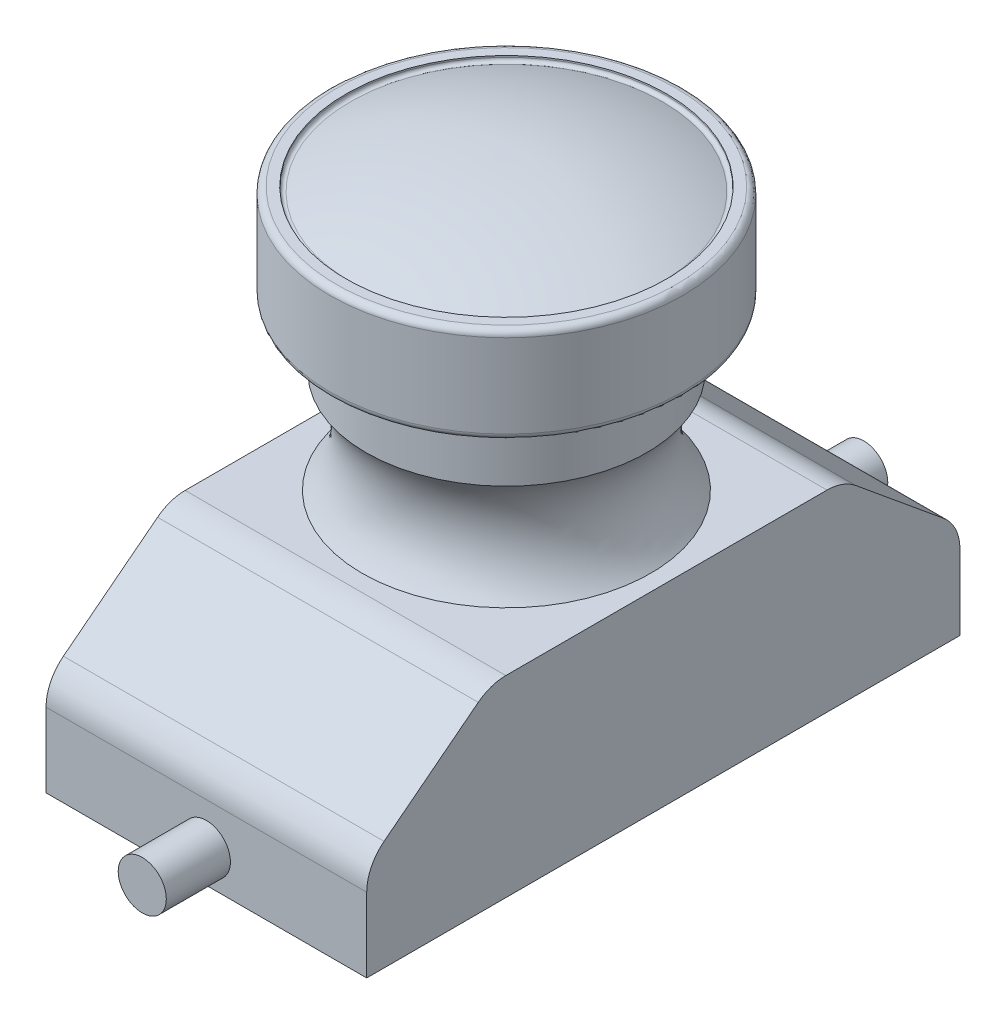
ISO-10303-21;
HEADER;
FILE_DESCRIPTION(('STEP AP214'),'2;1');
FILE_NAME('part.step','',(''),(''),'','','');
FILE_SCHEMA(('AUTOMOTIVE_DESIGN { 1 0 10303 214 1 1 1 1 }'));
ENDSEC;
DATA;
#1=APPLICATION_CONTEXT('core data for automotive mechanical design processes');
#2=APPLICATION_PROTOCOL_DEFINITION('international standard','automotive_design',2000,#1);
#3=PRODUCT_CONTEXT('',#1,'mechanical');
#4=PRODUCT('Part','Part','',(#3));
#5=PRODUCT_RELATED_PRODUCT_CATEGORY('part','',(#4));
#6=PRODUCT_DEFINITION_FORMATION('','',#4);
#7=PRODUCT_DEFINITION_CONTEXT('part definition',#1,'design');
#8=PRODUCT_DEFINITION('design','',#6,#7);
#9=PRODUCT_DEFINITION_SHAPE('','',#8);
#10=(LENGTH_UNIT() NAMED_UNIT(*) SI_UNIT(.MILLI.,.METRE.));
#11=(NAMED_UNIT(*) PLANE_ANGLE_UNIT() SI_UNIT($,.RADIAN.));
#12=(NAMED_UNIT(*) SI_UNIT($,.STERADIAN.) SOLID_ANGLE_UNIT());
#13=UNCERTAINTY_MEASURE_WITH_UNIT(LENGTH_MEASURE(1.E-05),#10,'distance_accuracy_value','');
#14=(GEOMETRIC_REPRESENTATION_CONTEXT(3) GLOBAL_UNCERTAINTY_ASSIGNED_CONTEXT((#13)) GLOBAL_UNIT_ASSIGNED_CONTEXT((#10,
#11,#12)) REPRESENTATION_CONTEXT('',''));
#15=CARTESIAN_POINT('',(0.,0.,0.));
#16=DIRECTION('',(0.,0.,1.));
#17=DIRECTION('',(1.,0.,0.));
#18=AXIS2_PLACEMENT_3D('',#15,#16,#17);
#19=CARTESIAN_POINT('',(5.,5.99362673541504,5.50758291933047));
#20=DIRECTION('',(0.,-1.,0.));
#21=DIRECTION('',(0.,0.,-1.));
#22=AXIS2_PLACEMENT_3D('',#19,#20,#21);
#23=PLANE('',#22);
#24=CARTESIAN_POINT('',(0.,5.99362673541504,0.00758291933046842));
#25=DIRECTION('',(0.,-1.,0.));
#26=DIRECTION('',(0.,0.,-1.));
#27=AXIS2_PLACEMENT_3D('',#24,#25,#26);
#28=CIRCLE('',#27,4.5);
#29=CARTESIAN_POINT('',(0.,5.99362673541504,-4.49241708066953));
#30=VERTEX_POINT('',#29);
#31=EDGE_CURVE('E227',#30,#30,#28,.T.);
#32=ORIENTED_EDGE('',*,*,#31,.T.);
#33=EDGE_LOOP('',(#32));
#34=FACE_BOUND('',#33,.T.);
#35=DIRECTION('',(0.,0.,1.));
#36=VECTOR('',#35,1.);
#37=CARTESIAN_POINT('',(5.,5.99362673541504,5.50758291933047));
#38=LINE('',#37,#36);
#39=CARTESIAN_POINT('',(5.,5.99362673541504,-4.99019765527548));
#40=VERTEX_POINT('',#39);
#41=CARTESIAN_POINT('',(5.,5.99362673541504,5.0271839133107));
#42=VERTEX_POINT('',#41);
#43=EDGE_CURVE('E213',#40,#42,#38,.T.);
#44=ORIENTED_EDGE('',*,*,#43,.F.);
#45=DIRECTION('',(-1.,0.,0.));
#46=VECTOR('',#45,1.);
#47=CARTESIAN_POINT('',(5.,5.99362673541504,-4.99019765527548));
#48=LINE('',#47,#46);
#49=CARTESIAN_POINT('',(-5.,5.99362673541504,-4.99019765527548));
#50=VERTEX_POINT('',#49);
#51=EDGE_CURVE('E188',#40,#50,#48,.T.);
#52=ORIENTED_EDGE('',*,*,#51,.T.);
#53=DIRECTION('',(0.,0.,1.));
#54=VECTOR('',#53,1.);
#55=CARTESIAN_POINT('',(-5.,5.99362673541504,5.50758291933047));
#56=LINE('',#55,#54);
#57=CARTESIAN_POINT('',(-5.,5.99362673541504,5.0271839133107));
#58=VERTEX_POINT('',#57);
#59=EDGE_CURVE('E223',#50,#58,#56,.T.);
#60=ORIENTED_EDGE('',*,*,#59,.T.);
#61=DIRECTION('',(-1.,0.,0.));
#62=VECTOR('',#61,1.);
#63=CARTESIAN_POINT('',(5.,5.99362673541504,5.0271839133107));
#64=LINE('',#63,#62);
#65=EDGE_CURVE('E186',#58,#42,#64,.F.);
#66=ORIENTED_EDGE('',*,*,#65,.T.);
#67=EDGE_LOOP('',(#44,#52,#60,#66));
#68=FACE_BOUND('',#67,.T.);
#69=ADVANCED_FACE('F40',(#34,#68),#23,.F.);
#70=CARTESIAN_POINT('',(5.,2.99362673541504,9.36423594558007));
#71=DIRECTION('',(0.,-0.789314429232731,-0.613989195185883));
#72=DIRECTION('',(0.,0.613989195185883,-0.789314429232731));
#73=AXIS2_PLACEMENT_3D('',#70,#71,#72);
#74=PLANE('',#73);
#75=DIRECTION('',(0.,-0.613989195185883,0.789314429232731));
#76=VECTOR('',#75,1.);
#77=CARTESIAN_POINT('',(-5.,2.99362673541504,9.36423594558007));
#78=LINE('',#77,#76);
#79=CARTESIAN_POINT('',(-5.,5.69866693634086,5.88676878657093));
#80=VERTEX_POINT('',#79);
#81=CARTESIAN_POINT('',(-5.,3.41400299669252,8.8238208188403));
#82=VERTEX_POINT('',#81);
#83=EDGE_CURVE('E226',#80,#82,#78,.T.);
#84=ORIENTED_EDGE('',*,*,#83,.T.);
#85=DIRECTION('',(-1.,0.,0.));
#86=VECTOR('',#85,1.);
#87=CARTESIAN_POINT('',(5.,3.41400299669252,8.8238208188403));
#88=LINE('',#87,#86);
#89=CARTESIAN_POINT('',(5.,3.41400299669252,8.8238208188403));
#90=VERTEX_POINT('',#89);
#91=EDGE_CURVE('E63',#82,#90,#88,.F.);
#92=ORIENTED_EDGE('',*,*,#91,.T.);
#93=DIRECTION('',(0.,-0.613989195185883,0.789314429232731));
#94=VECTOR('',#93,1.);
#95=CARTESIAN_POINT('',(5.,2.99362673541504,9.36423594558007));
#96=LINE('',#95,#94);
#97=CARTESIAN_POINT('',(5.,5.69866693634086,5.88676878657093));
#98=VERTEX_POINT('',#97);
#99=EDGE_CURVE('E209',#98,#90,#96,.T.);
#100=ORIENTED_EDGE('',*,*,#99,.F.);
#101=DIRECTION('',(-1.,0.,0.));
#102=VECTOR('',#101,1.);
#103=CARTESIAN_POINT('',(5.,5.69866693634086,5.88676878657093));
#104=LINE('',#103,#102);
#105=EDGE_CURVE('E192',#98,#80,#104,.T.);
#106=ORIENTED_EDGE('',*,*,#105,.T.);
#107=EDGE_LOOP('',(#84,#92,#100,#106));
#108=FACE_BOUND('',#107,.T.);
#109=ADVANCED_FACE('F139',(#108),#74,.F.);
#110=CARTESIAN_POINT('',(5.,-0.00637326458496207,9.36423594558007));
#111=DIRECTION('',(0.,0.,-1.));
#112=DIRECTION('',(-1.,0.,0.));
#113=AXIS2_PLACEMENT_3D('',#110,#111,#112);
#114=PLANE('',#113);
#115=CARTESIAN_POINT('',(0.,1.,9.36423594558007));
#116=DIRECTION('',(0.,0.,-1.));
#117=DIRECTION('',(-1.,0.,0.));
#118=AXIS2_PLACEMENT_3D('',#115,#116,#117);
#119=CIRCLE('',#118,0.75);
#120=CARTESIAN_POINT('',(-0.75,1.,9.36423594558007));
#121=VERTEX_POINT('',#120);
#122=EDGE_CURVE('E48',#121,#121,#119,.F.);
#123=ORIENTED_EDGE('',*,*,#122,.F.);
#124=EDGE_LOOP('',(#123));
#125=FACE_BOUND('',#124,.T.);
#126=DIRECTION('',(0.,-1.,0.));
#127=VECTOR('',#126,1.);
#128=CARTESIAN_POINT('',(5.,-0.00637326458496207,9.36423594558007));
#129=LINE('',#128,#127);
#130=CARTESIAN_POINT('',(5.,2.3089627957667,9.36423594558007));
#131=VERTEX_POINT('',#130);
#132=CARTESIAN_POINT('',(5.,-0.00637326458496207,9.36423594558007));
#133=VERTEX_POINT('',#132);
#134=EDGE_CURVE('E203',#131,#133,#129,.T.);
#135=ORIENTED_EDGE('',*,*,#134,.F.);
#136=DIRECTION('',(-1.,0.,0.));
#137=VECTOR('',#136,1.);
#138=CARTESIAN_POINT('',(5.,2.3089627957667,9.36423594558007));
#139=LINE('',#138,#137);
#140=CARTESIAN_POINT('',(-5.,2.3089627957667,9.36423594558007));
#141=VERTEX_POINT('',#140);
#142=EDGE_CURVE('E175',#131,#141,#139,.T.);
#143=ORIENTED_EDGE('',*,*,#142,.T.);
#144=DIRECTION('',(0.,-1.,0.));
#145=VECTOR('',#144,1.);
#146=CARTESIAN_POINT('',(-5.,-0.00637326458496207,9.36423594558007));
#147=LINE('',#146,#145);
#148=CARTESIAN_POINT('',(-5.,-0.00637326458496207,9.36423594558007));
#149=VERTEX_POINT('',#148);
#150=EDGE_CURVE('E229',#141,#149,#147,.T.);
#151=ORIENTED_EDGE('',*,*,#150,.T.);
#152=DIRECTION('',(-1.,0.,0.));
#153=VECTOR('',#152,1.);
#154=CARTESIAN_POINT('',(5.,-0.00637326458496207,9.36423594558007));
#155=LINE('',#154,#153);
#156=EDGE_CURVE('E206',#133,#149,#155,.T.);
#157=ORIENTED_EDGE('',*,*,#156,.F.);
#158=EDGE_LOOP('',(#135,#143,#151,#157));
#159=FACE_BOUND('',#158,.T.);
#160=ADVANCED_FACE('F145',(#125,#159),#114,.F.);
#161=CARTESIAN_POINT('',(5.,-0.00637326458496207,9.36423594558007));
#162=DIRECTION('',(0.,1.,0.));
#163=DIRECTION('',(0.,0.,1.));
#164=AXIS2_PLACEMENT_3D('',#161,#162,#163);
#165=PLANE('',#164);
#166=DIRECTION('',(0.,0.,-1.));
#167=VECTOR('',#166,1.);
#168=CARTESIAN_POINT('',(-5.,-0.00637326458496207,9.36423594558007));
#169=LINE('',#168,#167);
#170=CARTESIAN_POINT('',(-5.,-0.00637326458496207,-9.13576405441993));
#171=VERTEX_POINT('',#170);
#172=EDGE_CURVE('E231',#149,#171,#169,.T.);
#173=ORIENTED_EDGE('',*,*,#172,.T.);
#174=DIRECTION('',(-1.,0.,0.));
#175=VECTOR('',#174,1.);
#176=CARTESIAN_POINT('',(5.,-0.00637326458496207,-9.13576405441993));
#177=LINE('',#176,#175);
#178=CARTESIAN_POINT('',(5.,-0.00637326458496207,-9.13576405441993));
#179=VERTEX_POINT('',#178);
#180=EDGE_CURVE('E222',#179,#171,#177,.T.);
#181=ORIENTED_EDGE('',*,*,#180,.F.);
#182=DIRECTION('',(0.,0.,-1.));
#183=VECTOR('',#182,1.);
#184=CARTESIAN_POINT('',(5.,-0.00637326458496207,9.36423594558007));
#185=LINE('',#184,#183);
#186=EDGE_CURVE('E208',#133,#179,#185,.T.);
#187=ORIENTED_EDGE('',*,*,#186,.F.);
#188=ORIENTED_EDGE('',*,*,#156,.T.);
#189=EDGE_LOOP('',(#173,#181,#187,#188));
#190=FACE_BOUND('',#189,.T.);
#191=ADVANCED_FACE('F201',(#190),#165,.F.);
#192=CARTESIAN_POINT('',(5.,2.99362673541504,-9.13576405441994));
#193=DIRECTION('',(0.,0.,1.));
#194=DIRECTION('',(0.,-1.,0.));
#195=AXIS2_PLACEMENT_3D('',#192,#193,#194);
#196=PLANE('',#195);
#197=CARTESIAN_POINT('',(0.,0.999999999999995,-9.13576405441993));
#198=DIRECTION('',(0.,0.,1.));
#199=DIRECTION('',(0.,-1.,0.));
#200=AXIS2_PLACEMENT_3D('',#197,#198,#199);
#201=CIRCLE('',#200,0.75);
#202=CARTESIAN_POINT('',(0.,0.249999999999995,-9.13576405441993));
#203=VERTEX_POINT('',#202);
#204=EDGE_CURVE('E11',#203,#203,#201,.F.);
#205=ORIENTED_EDGE('',*,*,#204,.F.);
#206=EDGE_LOOP('',(#205));
#207=FACE_BOUND('',#206,.T.);
#208=DIRECTION('',(0.,1.,0.));
#209=VECTOR('',#208,1.);
#210=CARTESIAN_POINT('',(-5.,2.99362673541504,-9.13576405441994));
#211=LINE('',#210,#209);
#212=CARTESIAN_POINT('',(-5.,2.33287604195182,-9.13576405441994));
#213=VERTEX_POINT('',#212);
#214=EDGE_CURVE('E233',#171,#213,#211,.T.);
#215=ORIENTED_EDGE('',*,*,#214,.T.);
#216=DIRECTION('',(-1.,0.,0.));
#217=VECTOR('',#216,1.);
#218=CARTESIAN_POINT('',(5.,2.33287604195182,-9.13576405441994));
#219=LINE('',#218,#217);
#220=CARTESIAN_POINT('',(5.,2.33287604195182,-9.13576405441994));
#221=VERTEX_POINT('',#220);
#222=EDGE_CURVE('E181',#213,#221,#219,.F.);
#223=ORIENTED_EDGE('',*,*,#222,.T.);
#224=DIRECTION('',(0.,1.,0.));
#225=VECTOR('',#224,1.);
#226=CARTESIAN_POINT('',(5.,2.99362673541504,-9.13576405441994));
#227=LINE('',#226,#225);
#228=EDGE_CURVE('E211',#179,#221,#227,.T.);
#229=ORIENTED_EDGE('',*,*,#228,.F.);
#230=ORIENTED_EDGE('',*,*,#180,.T.);
#231=EDGE_LOOP('',(#215,#223,#229,#230));
#232=FACE_BOUND('',#231,.T.);
#233=ADVANCED_FACE('F274',(#207,#232),#196,.F.);
#234=CARTESIAN_POINT('',(5.,5.99362673541504,-5.49241708066953));
#235=DIRECTION('',(0.,-0.771972177142526,0.635656320441973));
#236=DIRECTION('',(0.,-0.635656320441973,-0.771972177142526));
#237=AXIS2_PLACEMENT_3D('',#234,#235,#236);
#238=PLANE('',#237);
#239=DIRECTION('',(0.,0.635656320441973,0.771972177142526));
#240=VECTOR('',#239,1.);
#241=CARTESIAN_POINT('',(5.,5.99362673541504,-5.49241708066953));
#242=LINE('',#241,#240);
#243=CARTESIAN_POINT('',(5.,3.41363708995135,-8.6256829030387));
#244=VERTEX_POINT('',#243);
#245=CARTESIAN_POINT('',(5.,5.67438778341458,-5.88011650389424));
#246=VERTEX_POINT('',#245);
#247=EDGE_CURVE('E219',#244,#246,#242,.T.);
#248=ORIENTED_EDGE('',*,*,#247,.F.);
#249=DIRECTION('',(-1.,0.,0.));
#250=VECTOR('',#249,1.);
#251=CARTESIAN_POINT('',(5.,3.41363708995135,-8.6256829030387));
#252=LINE('',#251,#250);
#253=CARTESIAN_POINT('',(-5.,3.41363708995135,-8.6256829030387));
#254=VERTEX_POINT('',#253);
#255=EDGE_CURVE('E261',#244,#254,#252,.T.);
#256=ORIENTED_EDGE('',*,*,#255,.T.);
#257=DIRECTION('',(0.,0.635656320441973,0.771972177142526));
#258=VECTOR('',#257,1.);
#259=CARTESIAN_POINT('',(-5.,5.99362673541504,-5.49241708066953));
#260=LINE('',#259,#258);
#261=CARTESIAN_POINT('',(-5.,5.67438778341458,-5.88011650389424));
#262=VERTEX_POINT('',#261);
#263=EDGE_CURVE('E236',#254,#262,#260,.T.);
#264=ORIENTED_EDGE('',*,*,#263,.T.);
#265=DIRECTION('',(-1.,0.,0.));
#266=VECTOR('',#265,1.);
#267=CARTESIAN_POINT('',(5.,5.67438778341458,-5.88011650389424));
#268=LINE('',#267,#266);
#269=EDGE_CURVE('E259',#262,#246,#268,.F.);
#270=ORIENTED_EDGE('',*,*,#269,.T.);
#271=EDGE_LOOP('',(#248,#256,#264,#270));
#272=FACE_BOUND('',#271,.T.);
#273=ADVANCED_FACE('F283',(#272),#238,.F.);
#274=CARTESIAN_POINT('',(5.,0.,0.));
#275=DIRECTION('',(-1.,0.,0.));
#276=DIRECTION('',(0.,0.,1.));
#277=AXIS2_PLACEMENT_3D('',#274,#275,#276);
#278=PLANE('',#277);
#279=ORIENTED_EDGE('',*,*,#228,.T.);
#280=CARTESIAN_POINT('',(5.,2.33287604195182,-7.73576405441993));
#281=DIRECTION('',(-1.,0.,0.));
#282=DIRECTION('',(0.,0.,1.));
#283=AXIS2_PLACEMENT_3D('',#280,#281,#282);
#284=CIRCLE('',#283,1.4);
#285=EDGE_CURVE('E179',#221,#244,#284,.F.);
#286=ORIENTED_EDGE('',*,*,#285,.T.);
#287=ORIENTED_EDGE('',*,*,#247,.T.);
#288=CARTESIAN_POINT('',(5.,4.59362673541504,-4.99019765527548));
#289=DIRECTION('',(-1.,0.,0.));
#290=DIRECTION('',(0.,0.,1.));
#291=AXIS2_PLACEMENT_3D('',#288,#289,#290);
#292=CIRCLE('',#291,1.4);
#293=EDGE_CURVE('E176',#246,#40,#292,.F.);
#294=ORIENTED_EDGE('',*,*,#293,.T.);
#295=ORIENTED_EDGE('',*,*,#43,.T.);
#296=CARTESIAN_POINT('',(5.,4.59362673541504,5.0271839133107));
#297=DIRECTION('',(-1.,0.,0.));
#298=DIRECTION('',(0.,0.,1.));
#299=AXIS2_PLACEMENT_3D('',#296,#297,#298);
#300=CIRCLE('',#299,1.4);
#301=EDGE_CURVE('E177',#42,#98,#300,.F.);
#302=ORIENTED_EDGE('',*,*,#301,.T.);
#303=ORIENTED_EDGE('',*,*,#99,.T.);
#304=CARTESIAN_POINT('',(5.,2.3089627957667,7.96423594558007));
#305=DIRECTION('',(-1.,0.,0.));
#306=DIRECTION('',(0.,0.,1.));
#307=AXIS2_PLACEMENT_3D('',#304,#305,#306);
#308=CIRCLE('',#307,1.4);
#309=EDGE_CURVE('E55',#90,#131,#308,.F.);
#310=ORIENTED_EDGE('',*,*,#309,.T.);
#311=ORIENTED_EDGE('',*,*,#134,.T.);
#312=ORIENTED_EDGE('',*,*,#186,.T.);
#313=EDGE_LOOP('',(#279,#286,#287,#294,#295,#302,#303,#310,#311,#312));
#314=FACE_BOUND('',#313,.T.);
#315=ADVANCED_FACE('F277',(#314),#278,.F.);
#316=CARTESIAN_POINT('',(-5.,0.,0.));
#317=DIRECTION('',(-1.,0.,0.));
#318=DIRECTION('',(0.,0.,1.));
#319=AXIS2_PLACEMENT_3D('',#316,#317,#318);
#320=PLANE('',#319);
#321=ORIENTED_EDGE('',*,*,#263,.F.);
#322=CARTESIAN_POINT('',(-5.,2.33287604195182,-7.73576405441993));
#323=DIRECTION('',(-1.,0.,0.));
#324=DIRECTION('',(0.,0.,1.));
#325=AXIS2_PLACEMENT_3D('',#322,#323,#324);
#326=CIRCLE('',#325,1.4);
#327=EDGE_CURVE('E270',#254,#213,#326,.T.);
#328=ORIENTED_EDGE('',*,*,#327,.T.);
#329=ORIENTED_EDGE('',*,*,#214,.F.);
#330=ORIENTED_EDGE('',*,*,#172,.F.);
#331=ORIENTED_EDGE('',*,*,#150,.F.);
#332=CARTESIAN_POINT('',(-5.,2.3089627957667,7.96423594558007));
#333=DIRECTION('',(-1.,0.,0.));
#334=DIRECTION('',(0.,0.,1.));
#335=AXIS2_PLACEMENT_3D('',#332,#333,#334);
#336=CIRCLE('',#335,1.4);
#337=EDGE_CURVE('E266',#141,#82,#336,.T.);
#338=ORIENTED_EDGE('',*,*,#337,.T.);
#339=ORIENTED_EDGE('',*,*,#83,.F.);
#340=CARTESIAN_POINT('',(-5.,4.59362673541504,5.0271839133107));
#341=DIRECTION('',(-1.,0.,0.));
#342=DIRECTION('',(0.,0.,1.));
#343=AXIS2_PLACEMENT_3D('',#340,#341,#342);
#344=CIRCLE('',#343,1.4);
#345=EDGE_CURVE('E264',#80,#58,#344,.T.);
#346=ORIENTED_EDGE('',*,*,#345,.T.);
#347=ORIENTED_EDGE('',*,*,#59,.F.);
#348=CARTESIAN_POINT('',(-5.,4.59362673541504,-4.99019765527548));
#349=DIRECTION('',(-1.,0.,0.));
#350=DIRECTION('',(0.,0.,1.));
#351=AXIS2_PLACEMENT_3D('',#348,#349,#350);
#352=CIRCLE('',#351,1.4);
#353=EDGE_CURVE('E268',#50,#262,#352,.T.);
#354=ORIENTED_EDGE('',*,*,#353,.T.);
#355=EDGE_LOOP('',(#321,#328,#329,#330,#331,#338,#339,#346,#347,#354));
#356=FACE_BOUND('',#355,.T.);
#357=ADVANCED_FACE('F286',(#356),#320,.T.);
#358=CARTESIAN_POINT('',(0.,7.66507101754234,0.00758291933046842));
#359=DIRECTION('',(0.,-1.,0.));
#360=DIRECTION('',(0.,0.,-1.));
#361=AXIS2_PLACEMENT_3D('',#358,#359,#360);
#362=TOROIDAL_SURFACE('',#361,6.3591057021439,2.5);
#363=ORIENTED_EDGE('',*,*,#31,.F.);
#364=EDGE_LOOP('',(#363));
#365=FACE_BOUND('',#364,.T.);
#366=CARTESIAN_POINT('',(0.,9.19362673541504,0.00758291933046842));
#367=DIRECTION('',(0.,-1.,0.));
#368=DIRECTION('',(0.,0.,-1.));
#369=AXIS2_PLACEMENT_3D('',#366,#367,#368);
#370=CIRCLE('',#369,4.38084449154539);
#371=CARTESIAN_POINT('',(0.,9.19362673541504,-4.37326157221492));
#372=VERTEX_POINT('',#371);
#373=EDGE_CURVE('E296',#372,#372,#370,.T.);
#374=ORIENTED_EDGE('',*,*,#373,.T.);
#375=EDGE_LOOP('',(#374));
#376=FACE_BOUND('',#375,.T.);
#377=ADVANCED_FACE('F333',(#365,#376),#362,.F.);
#378=CARTESIAN_POINT('',(0.,5.99362673541504,0.00758291933046842));
#379=DIRECTION('',(0.,-1.,0.));
#380=DIRECTION('',(0.,0.,-1.));
#381=AXIS2_PLACEMENT_3D('',#378,#379,#380);
#382=CYLINDRICAL_SURFACE('',#381,4.38084449154539);
#383=ORIENTED_EDGE('',*,*,#373,.F.);
#384=EDGE_LOOP('',(#383));
#385=FACE_BOUND('',#384,.T.);
#386=CARTESIAN_POINT('',(0.,11.193626735415,0.00758291933046842));
#387=DIRECTION('',(0.,-1.,0.));
#388=DIRECTION('',(0.,0.,-1.));
#389=AXIS2_PLACEMENT_3D('',#386,#387,#388);
#390=CIRCLE('',#389,4.38084449154539);
#391=CARTESIAN_POINT('',(0.,11.193626735415,-4.37326157221492));
#392=VERTEX_POINT('',#391);
#393=EDGE_CURVE('E299',#392,#392,#390,.T.);
#394=ORIENTED_EDGE('',*,*,#393,.T.);
#395=EDGE_LOOP('',(#394));
#396=FACE_BOUND('',#395,.T.);
#397=ADVANCED_FACE('F338',(#385,#396),#382,.T.);
#398=CARTESIAN_POINT('',(0.,11.193626735415,5.50758291933047));
#399=DIRECTION('',(0.,1.,0.));
#400=DIRECTION('',(0.,0.,1.));
#401=AXIS2_PLACEMENT_3D('',#398,#399,#400);
#402=PLANE('',#401);
#403=CARTESIAN_POINT('',(0.,11.193626735415,0.00758291933046842));
#404=DIRECTION('',(0.,1.,0.));
#405=DIRECTION('',(0.,0.,1.));
#406=AXIS2_PLACEMENT_3D('',#403,#404,#405);
#407=CIRCLE('',#406,5.3);
#408=CARTESIAN_POINT('',(0.,11.193626735415,5.30758291933047));
#409=VERTEX_POINT('',#408);
#410=EDGE_CURVE('E242',#409,#409,#407,.F.);
#411=ORIENTED_EDGE('',*,*,#410,.T.);
#412=EDGE_LOOP('',(#411));
#413=FACE_BOUND('',#412,.T.);
#414=ORIENTED_EDGE('',*,*,#393,.F.);
#415=EDGE_LOOP('',(#414));
#416=FACE_BOUND('',#415,.T.);
#417=ADVANCED_FACE('F342',(#413,#416),#402,.F.);
#418=CARTESIAN_POINT('',(0.,5.99362673541504,0.00758291933046842));
#419=DIRECTION('',(0.,-1.,0.));
#420=DIRECTION('',(0.,0.,-1.));
#421=AXIS2_PLACEMENT_3D('',#418,#419,#420);
#422=CYLINDRICAL_SURFACE('',#421,5.5);
#423=CARTESIAN_POINT('',(0.,11.393626735415,0.00758291933046842));
#424=DIRECTION('',(0.,1.,0.));
#425=DIRECTION('',(0.,0.,1.));
#426=AXIS2_PLACEMENT_3D('',#423,#424,#425);
#427=CIRCLE('',#426,5.5);
#428=CARTESIAN_POINT('',(0.,11.393626735415,5.50758291933047));
#429=VERTEX_POINT('',#428);
#430=EDGE_CURVE('E248',#429,#429,#427,.T.);
#431=ORIENTED_EDGE('',*,*,#430,.T.);
#432=EDGE_LOOP('',(#431));
#433=FACE_BOUND('',#432,.T.);
#434=CARTESIAN_POINT('',(0.,13.993626735415,0.00758291933046842));
#435=DIRECTION('',(0.,-1.,0.));
#436=DIRECTION('',(0.,0.,-1.));
#437=AXIS2_PLACEMENT_3D('',#434,#435,#436);
#438=CIRCLE('',#437,5.5);
#439=CARTESIAN_POINT('',(0.,13.993626735415,-5.49241708066953));
#440=VERTEX_POINT('',#439);
#441=EDGE_CURVE('E245',#440,#440,#438,.T.);
#442=ORIENTED_EDGE('',*,*,#441,.T.);
#443=EDGE_LOOP('',(#442));
#444=FACE_BOUND('',#443,.T.);
#445=ADVANCED_FACE('F346',(#433,#444),#422,.T.);
#446=CARTESIAN_POINT('',(0.,14.193626735415,5.00758291933047));
#447=DIRECTION('',(0.,-1.,0.));
#448=DIRECTION('',(0.,0.,-1.));
#449=AXIS2_PLACEMENT_3D('',#446,#447,#448);
#450=PLANE('',#449);
#451=CARTESIAN_POINT('',(0.,14.193626735415,0.00758291933046842));
#452=DIRECTION('',(0.,-1.,0.));
#453=DIRECTION('',(0.,0.,-1.));
#454=AXIS2_PLACEMENT_3D('',#451,#452,#453);
#455=CIRCLE('',#454,5.3);
#456=CARTESIAN_POINT('',(0.,14.193626735415,-5.29241708066953));
#457=VERTEX_POINT('',#456);
#458=EDGE_CURVE('E251',#457,#457,#455,.F.);
#459=ORIENTED_EDGE('',*,*,#458,.T.);
#460=EDGE_LOOP('',(#459));
#461=FACE_BOUND('',#460,.T.);
#462=CARTESIAN_POINT('',(0.,14.193626735415,0.00758291933046842));
#463=DIRECTION('',(0.,-1.,0.));
#464=DIRECTION('',(0.,0.,-1.));
#465=AXIS2_PLACEMENT_3D('',#462,#463,#464);
#466=CIRCLE('',#465,5.);
#467=CARTESIAN_POINT('',(0.,14.193626735415,-4.99241708066953));
#468=VERTEX_POINT('',#467);
#469=EDGE_CURVE('E302',#468,#468,#466,.T.);
#470=ORIENTED_EDGE('',*,*,#469,.T.);
#471=EDGE_LOOP('',(#470));
#472=FACE_BOUND('',#471,.T.);
#473=ADVANCED_FACE('F133',(#461,#472),#450,.F.);
#474=CARTESIAN_POINT('',(0.,5.99362673541504,0.00758291933046842));
#475=DIRECTION('',(0.,-1.,0.));
#476=DIRECTION('',(0.,0.,-1.));
#477=AXIS2_PLACEMENT_3D('',#474,#475,#476);
#478=CYLINDRICAL_SURFACE('',#477,5.);
#479=CARTESIAN_POINT('',(0.,14.14532797354,0.00758291933046842));
#480=DIRECTION('',(0.,-1.,0.));
#481=DIRECTION('',(0.,0.,-1.));
#482=AXIS2_PLACEMENT_3D('',#479,#480,#481);
#483=CIRCLE('',#482,5.);
#484=CARTESIAN_POINT('',(0.,14.14532797354,-4.99241708066953));
#485=VERTEX_POINT('',#484);
#486=EDGE_CURVE('E254',#485,#485,#483,.T.);
#487=ORIENTED_EDGE('',*,*,#486,.T.);
#488=EDGE_LOOP('',(#487));
#489=FACE_BOUND('',#488,.T.);
#490=ORIENTED_EDGE('',*,*,#469,.F.);
#491=EDGE_LOOP('',(#490));
#492=FACE_BOUND('',#491,.T.);
#493=ADVANCED_FACE('F123',(#489,#492),#478,.F.);
#494=CARTESIAN_POINT('',(0.,2.99529909781754,-0.19275155315003));
#495=DIRECTION('',(-1.,0.,0.));
#496=DIRECTION('',(0.,0.,-1.));
#497=AXIS2_PLACEMENT_3D('',#494,#495,#496);
#498=CIRCLE('',#497,12.);
#499=TRIMMED_CURVE('',#498,(PARAMETER_VALUE(-1.58749164174817)),
(PARAMETER_VALUE(1.58749164174817)),.T.,.PARAMETER.);
#500=CARTESIAN_POINT('',(0.,2.99529909781754,0.00758291933046842));
#501=DIRECTION('',(0.,-1.,0.));
#502=AXIS1_PLACEMENT('',#500,#501);
#503=SURFACE_OF_REVOLUTION('',#499,#502);
#504=CARTESIAN_POINT('',(0.,14.0531789745671,0.00758291933046842));
#505=DIRECTION('',(0.,-1.,0.));
#506=DIRECTION('',(0.,0.,-1.));
#507=AXIS2_PLACEMENT_3D('',#504,#505,#506);
#508=CIRCLE('',#507,4.86115978902876);
#509=CARTESIAN_POINT('',(0.,14.0531789745671,-4.8535768696983));
#510=VERTEX_POINT('',#509);
#511=EDGE_CURVE('E257',#510,#510,#508,.F.);
#512=ORIENTED_EDGE('',*,*,#511,.T.);
#513=EDGE_LOOP('',(#512));
#514=FACE_BOUND('',#513,.T.);
#515=CARTESIAN_POINT('',(0.,14.993626735415,0.00758291933046842));
#516=VERTEX_POINT('',#515);
#517=VERTEX_LOOP('',#516);
#518=FACE_BOUND('',#517,.T.);
#519=ADVANCED_FACE('F120',(#514,#518),#503,.T.);
#520=CARTESIAN_POINT('',(0.,11.393626735415,0.00758291933046842));
#521=DIRECTION('',(0.,1.,0.));
#522=DIRECTION('',(0.,0.,1.));
#523=AXIS2_PLACEMENT_3D('',#520,#521,#522);
#524=TOROIDAL_SURFACE('',#523,5.3,0.2);
#525=ORIENTED_EDGE('',*,*,#430,.F.);
#526=EDGE_LOOP('',(#525));
#527=FACE_BOUND('',#526,.T.);
#528=ORIENTED_EDGE('',*,*,#410,.F.);
#529=EDGE_LOOP('',(#528));
#530=FACE_BOUND('',#529,.T.);
#531=ADVANCED_FACE('F122',(#527,#530),#524,.T.);
#532=CARTESIAN_POINT('',(0.,13.993626735415,0.00758291933046842));
#533=DIRECTION('',(0.,-1.,0.));
#534=DIRECTION('',(0.,0.,-1.));
#535=AXIS2_PLACEMENT_3D('',#532,#533,#534);
#536=TOROIDAL_SURFACE('',#535,5.3,0.2);
#537=ORIENTED_EDGE('',*,*,#458,.F.);
#538=EDGE_LOOP('',(#537));
#539=FACE_BOUND('',#538,.T.);
#540=ORIENTED_EDGE('',*,*,#441,.F.);
#541=EDGE_LOOP('',(#540));
#542=FACE_BOUND('',#541,.T.);
#543=ADVANCED_FACE('F130',(#539,#542),#536,.T.);
#544=CARTESIAN_POINT('',(0.,14.14532797354,0.00758291933046842));
#545=DIRECTION('',(0.,-1.,0.));
#546=DIRECTION('',(0.,0.,-1.));
#547=AXIS2_PLACEMENT_3D('',#544,#545,#546);
#548=TOROIDAL_SURFACE('',#547,4.9,0.1);
#549=ORIENTED_EDGE('',*,*,#511,.F.);
#550=EDGE_LOOP('',(#549));
#551=FACE_BOUND('',#550,.T.);
#552=ORIENTED_EDGE('',*,*,#486,.F.);
#553=EDGE_LOOP('',(#552));
#554=FACE_BOUND('',#553,.T.);
#555=ADVANCED_FACE('F153',(#551,#554),#548,.F.);
#556=CARTESIAN_POINT('',(5.,2.33287604195182,-7.73576405441993));
#557=DIRECTION('',(-1.,0.,0.));
#558=DIRECTION('',(0.,0.,1.));
#559=AXIS2_PLACEMENT_3D('',#556,#557,#558);
#560=CYLINDRICAL_SURFACE('',#559,1.4);
#561=ORIENTED_EDGE('',*,*,#285,.F.);
#562=ORIENTED_EDGE('',*,*,#222,.F.);
#563=ORIENTED_EDGE('',*,*,#327,.F.);
#564=ORIENTED_EDGE('',*,*,#255,.F.);
#565=EDGE_LOOP('',(#561,#562,#563,#564));
#566=FACE_BOUND('',#565,.T.);
#567=ADVANCED_FACE('F157',(#566),#560,.T.);
#568=CARTESIAN_POINT('',(5.,4.59362673541504,-4.99019765527548));
#569=DIRECTION('',(-1.,0.,0.));
#570=DIRECTION('',(0.,0.,1.));
#571=AXIS2_PLACEMENT_3D('',#568,#569,#570);
#572=CYLINDRICAL_SURFACE('',#571,1.4);
#573=ORIENTED_EDGE('',*,*,#293,.F.);
#574=ORIENTED_EDGE('',*,*,#269,.F.);
#575=ORIENTED_EDGE('',*,*,#353,.F.);
#576=ORIENTED_EDGE('',*,*,#51,.F.);
#577=EDGE_LOOP('',(#573,#574,#575,#576));
#578=FACE_BOUND('',#577,.T.);
#579=ADVANCED_FACE('F161',(#578),#572,.T.);
#580=CARTESIAN_POINT('',(5.,2.3089627957667,7.96423594558007));
#581=DIRECTION('',(-1.,0.,0.));
#582=DIRECTION('',(0.,0.,1.));
#583=AXIS2_PLACEMENT_3D('',#580,#581,#582);
#584=CYLINDRICAL_SURFACE('',#583,1.4);
#585=ORIENTED_EDGE('',*,*,#309,.F.);
#586=ORIENTED_EDGE('',*,*,#91,.F.);
#587=ORIENTED_EDGE('',*,*,#337,.F.);
#588=ORIENTED_EDGE('',*,*,#142,.F.);
#589=EDGE_LOOP('',(#585,#586,#587,#588));
#590=FACE_BOUND('',#589,.T.);
#591=ADVANCED_FACE('F164',(#590),#584,.T.);
#592=CARTESIAN_POINT('',(5.,4.59362673541504,5.0271839133107));
#593=DIRECTION('',(-1.,0.,0.));
#594=DIRECTION('',(0.,0.,1.));
#595=AXIS2_PLACEMENT_3D('',#592,#593,#594);
#596=CYLINDRICAL_SURFACE('',#595,1.4);
#597=ORIENTED_EDGE('',*,*,#301,.F.);
#598=ORIENTED_EDGE('',*,*,#65,.F.);
#599=ORIENTED_EDGE('',*,*,#345,.F.);
#600=ORIENTED_EDGE('',*,*,#105,.F.);
#601=EDGE_LOOP('',(#597,#598,#599,#600));
#602=FACE_BOUND('',#601,.T.);
#603=ADVANCED_FACE('F42',(#602),#596,.T.);
#604=CARTESIAN_POINT('',(0.,1.,11.3642359455801));
#605=DIRECTION('',(0.,0.,-1.));
#606=DIRECTION('',(-1.,0.,0.));
#607=AXIS2_PLACEMENT_3D('',#604,#605,#606);
#608=CYLINDRICAL_SURFACE('',#607,0.75);
#609=CARTESIAN_POINT('',(0.,1.,11.3642359455801));
#610=DIRECTION('',(0.,0.,1.));
#611=DIRECTION('',(1.,0.,0.));
#612=AXIS2_PLACEMENT_3D('',#609,#610,#611);
#613=CIRCLE('',#612,0.75);
#614=CARTESIAN_POINT('',(0.75,1.,11.3642359455801));
#615=VERTEX_POINT('',#614);
#616=EDGE_CURVE('E305',#615,#615,#613,.T.);
#617=ORIENTED_EDGE('',*,*,#616,.F.);
#618=EDGE_LOOP('',(#617));
#619=FACE_BOUND('',#618,.T.);
#620=ORIENTED_EDGE('',*,*,#122,.T.);
#621=EDGE_LOOP('',(#620));
#622=FACE_BOUND('',#621,.T.);
#623=ADVANCED_FACE('F171',(#619,#622),#608,.T.);
#624=CARTESIAN_POINT('',(0.,1.,11.3642359455801));
#625=DIRECTION('',(0.,0.,1.));
#626=DIRECTION('',(1.,0.,0.));
#627=AXIS2_PLACEMENT_3D('',#624,#625,#626);
#628=PLANE('',#627);
#629=ORIENTED_EDGE('',*,*,#616,.T.);
#630=EDGE_LOOP('',(#629));
#631=FACE_BOUND('',#630,.T.);
#632=ADVANCED_FACE('F317',(#631),#628,.T.);
#633=CARTESIAN_POINT('',(0.,0.999999999999994,-11.1357640544199));
#634=DIRECTION('',(0.,0.,1.));
#635=DIRECTION('',(0.,-1.,0.));
#636=AXIS2_PLACEMENT_3D('',#633,#634,#635);
#637=CYLINDRICAL_SURFACE('',#636,0.75);
#638=CARTESIAN_POINT('',(0.,0.999999999999994,-11.1357640544199));
#639=DIRECTION('',(0.,0.,-1.));
#640=DIRECTION('',(0.,1.,0.));
#641=AXIS2_PLACEMENT_3D('',#638,#639,#640);
#642=CIRCLE('',#641,0.75);
#643=CARTESIAN_POINT('',(0.,1.74999999999999,-11.1357640544199));
#644=VERTEX_POINT('',#643);
#645=EDGE_CURVE('E308',#644,#644,#642,.T.);
#646=ORIENTED_EDGE('',*,*,#645,.F.);
#647=EDGE_LOOP('',(#646));
#648=FACE_BOUND('',#647,.T.);
#649=ORIENTED_EDGE('',*,*,#204,.T.);
#650=EDGE_LOOP('',(#649));
#651=FACE_BOUND('',#650,.T.);
#652=ADVANCED_FACE('F314',(#648,#651),#637,.T.);
#653=CARTESIAN_POINT('',(0.,0.999999999999994,-11.1357640544199));
#654=DIRECTION('',(0.,0.,-1.));
#655=DIRECTION('',(0.,1.,0.));
#656=AXIS2_PLACEMENT_3D('',#653,#654,#655);
#657=PLANE('',#656);
#658=ORIENTED_EDGE('',*,*,#645,.T.);
#659=EDGE_LOOP('',(#658));
#660=FACE_BOUND('',#659,.T.);
#661=ADVANCED_FACE('F312',(#660),#657,.T.);
#662=CLOSED_SHELL('',(#69,#109,#160,#191,#233,#273,#315,#357,#377,#397,#417,#445,#473,#493,#519,
#531,#543,#555,#567,#579,#591,#603,#623,#632,#652,#661));
#663=MANIFOLD_SOLID_BREP('B2',#662);
#664=ADVANCED_BREP_SHAPE_REPRESENTATION('',(#18,#663),#14);
#665=SHAPE_DEFINITION_REPRESENTATION(#9,#664);
ENDSEC;
END-ISO-10303-21;
